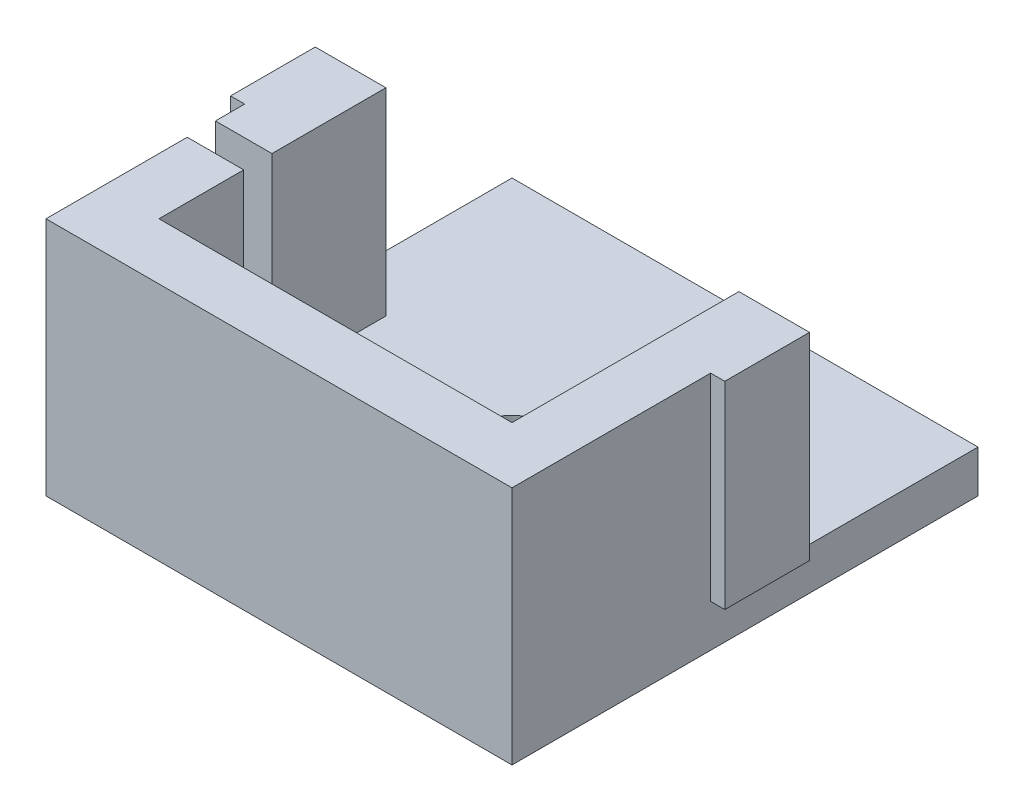
ISO-10303-21;
HEADER;
FILE_DESCRIPTION(('STEP AP214'),'2;1');
FILE_NAME('part.step','',(''),(''),'','','');
FILE_SCHEMA(('AUTOMOTIVE_DESIGN { 1 0 10303 214 1 1 1 1 }'));
ENDSEC;
DATA;
#1=APPLICATION_CONTEXT('core data for automotive mechanical design processes');
#2=APPLICATION_PROTOCOL_DEFINITION('international standard','automotive_design',2000,#1);
#3=PRODUCT_CONTEXT('',#1,'mechanical');
#4=PRODUCT('Part','Part','',(#3));
#5=PRODUCT_RELATED_PRODUCT_CATEGORY('part','',(#4));
#6=PRODUCT_DEFINITION_FORMATION('','',#4);
#7=PRODUCT_DEFINITION_CONTEXT('part definition',#1,'design');
#8=PRODUCT_DEFINITION('design','',#6,#7);
#9=PRODUCT_DEFINITION_SHAPE('','',#8);
#10=(LENGTH_UNIT() NAMED_UNIT(*) SI_UNIT(.MILLI.,.METRE.));
#11=(NAMED_UNIT(*) PLANE_ANGLE_UNIT() SI_UNIT($,.RADIAN.));
#12=(NAMED_UNIT(*) SI_UNIT($,.STERADIAN.) SOLID_ANGLE_UNIT());
#13=UNCERTAINTY_MEASURE_WITH_UNIT(LENGTH_MEASURE(1.E-05),#10,'distance_accuracy_value','');
#14=(GEOMETRIC_REPRESENTATION_CONTEXT(3) GLOBAL_UNCERTAINTY_ASSIGNED_CONTEXT((#13)) GLOBAL_UNIT_ASSIGNED_CONTEXT((#10,
#11,#12)) REPRESENTATION_CONTEXT('',''));
#15=CARTESIAN_POINT('',(0.,0.,0.));
#16=DIRECTION('',(0.,0.,1.));
#17=DIRECTION('',(1.,0.,0.));
#18=AXIS2_PLACEMENT_3D('',#15,#16,#17);
#19=CARTESIAN_POINT('',(-14.2941176470588,3.,-10.8529411764706));
#20=DIRECTION('',(-1.,0.,0.));
#21=DIRECTION('',(0.,0.,1.));
#22=AXIS2_PLACEMENT_3D('',#19,#20,#21);
#23=PLANE('',#22);
#24=DIRECTION('',(0.,0.,1.));
#25=VECTOR('',#24,1.);
#26=CARTESIAN_POINT('',(-14.2941176470588,17.,-10.8529411764706));
#27=LINE('',#26,#25);
#28=CARTESIAN_POINT('',(-14.2941176470588,17.,-1.9215861258733));
#29=VERTEX_POINT('',#28);
#30=CARTESIAN_POINT('',(-14.2941176470588,17.,6.14705882352941));
#31=VERTEX_POINT('',#30);
#32=EDGE_CURVE('E269',#29,#31,#27,.T.);
#33=ORIENTED_EDGE('',*,*,#32,.T.);
#34=DIRECTION('',(0.,1.,0.));
#35=VECTOR('',#34,1.);
#36=CARTESIAN_POINT('',(-14.2941176470588,3.,6.14705882352941));
#37=LINE('',#36,#35);
#38=CARTESIAN_POINT('',(-14.2941176470588,3.,6.14705882352941));
#39=VERTEX_POINT('',#38);
#40=EDGE_CURVE('E188',#39,#31,#37,.T.);
#41=ORIENTED_EDGE('',*,*,#40,.F.);
#42=DIRECTION('',(0.,0.,1.));
#43=VECTOR('',#42,1.);
#44=CARTESIAN_POINT('',(-14.2941176470588,3.,-10.8529411764706));
#45=LINE('',#44,#43);
#46=CARTESIAN_POINT('',(-14.2941176470588,3.,-1.9215861258733));
#47=VERTEX_POINT('',#46);
#48=EDGE_CURVE('E259',#47,#39,#45,.T.);
#49=ORIENTED_EDGE('',*,*,#48,.F.);
#50=DIRECTION('',(0.,1.,0.));
#51=VECTOR('',#50,1.);
#52=CARTESIAN_POINT('',(-14.2941176470588,3.,-1.9215861258733));
#53=LINE('',#52,#51);
#54=EDGE_CURVE('E248',#47,#29,#53,.T.);
#55=ORIENTED_EDGE('',*,*,#54,.T.);
#56=EDGE_LOOP('',(#33,#41,#49,#55));
#57=FACE_BOUND('',#56,.T.);
#58=ADVANCED_FACE('F34',(#57),#23,.F.);
#59=CARTESIAN_POINT('',(0.,17.,0.));
#60=DIRECTION('',(0.,1.,0.));
#61=DIRECTION('',(0.,0.,1.));
#62=AXIS2_PLACEMENT_3D('',#59,#60,#61);
#63=PLANE('',#62);
#64=DIRECTION('',(-1.,0.,0.));
#65=VECTOR('',#64,1.);
#66=CARTESIAN_POINT('',(-18.2941176470588,17.,6.14705882352941));
#67=LINE('',#66,#65);
#68=CARTESIAN_POINT('',(-18.2941176470588,17.,6.14705882352941));
#69=VERTEX_POINT('',#68);
#70=EDGE_CURVE('E182',#31,#69,#67,.T.);
#71=ORIENTED_EDGE('',*,*,#70,.F.);
#72=ORIENTED_EDGE('',*,*,#32,.F.);
#73=DIRECTION('',(1.,0.,0.));
#74=VECTOR('',#73,1.);
#75=CARTESIAN_POINT('',(-14.2941176470588,17.,-1.9215861258733));
#76=LINE('',#75,#74);
#77=CARTESIAN_POINT('',(-19.2941176470588,17.,-1.9215861258733));
#78=VERTEX_POINT('',#77);
#79=EDGE_CURVE('E239',#78,#29,#76,.T.);
#80=ORIENTED_EDGE('',*,*,#79,.F.);
#81=DIRECTION('',(0.,0.,1.));
#82=VECTOR('',#81,1.);
#83=CARTESIAN_POINT('',(-19.2941176470588,17.,4.0784138741267));
#84=LINE('',#83,#82);
#85=CARTESIAN_POINT('',(-19.2941176470588,17.,4.0784138741267));
#86=VERTEX_POINT('',#85);
#87=EDGE_CURVE('E193',#78,#86,#84,.T.);
#88=ORIENTED_EDGE('',*,*,#87,.T.);
#89=DIRECTION('',(1.,0.,0.));
#90=VECTOR('',#89,1.);
#91=CARTESIAN_POINT('',(-18.2941176470588,17.,4.0784138741267));
#92=LINE('',#91,#90);
#93=CARTESIAN_POINT('',(-18.2941176470588,17.,4.0784138741267));
#94=VERTEX_POINT('',#93);
#95=EDGE_CURVE('E195',#86,#94,#92,.T.);
#96=ORIENTED_EDGE('',*,*,#95,.T.);
#97=DIRECTION('',(0.,0.,1.));
#98=VECTOR('',#97,1.);
#99=CARTESIAN_POINT('',(-18.2941176470588,17.,-14.8529411764706));
#100=LINE('',#99,#98);
#101=EDGE_CURVE('E286',#94,#69,#100,.T.);
#102=ORIENTED_EDGE('',*,*,#101,.T.);
#103=EDGE_LOOP('',(#71,#72,#80,#88,#96,#102));
#104=FACE_BOUND('',#103,.T.);
#105=ADVANCED_FACE('F385',(#104),#63,.T.);
#106=CARTESIAN_POINT('',(-18.2941176470588,17.,-14.8529411764706));
#107=DIRECTION('',(0.,0.,1.));
#108=DIRECTION('',(1.,0.,0.));
#109=AXIS2_PLACEMENT_3D('',#106,#107,#108);
#110=PLANE('',#109);
#111=DIRECTION('',(0.,-1.,0.));
#112=VECTOR('',#111,1.);
#113=CARTESIAN_POINT('',(-18.2941176470588,17.,-14.8529411764706));
#114=LINE('',#113,#112);
#115=CARTESIAN_POINT('',(-18.2941176470588,3.,-14.8529411764706));
#116=VERTEX_POINT('',#115);
#117=CARTESIAN_POINT('',(-18.2941176470588,0.,-14.8529411764706));
#118=VERTEX_POINT('',#117);
#119=EDGE_CURVE('E294',#116,#118,#114,.T.);
#120=ORIENTED_EDGE('',*,*,#119,.F.);
#121=DIRECTION('',(-1.,0.,0.));
#122=VECTOR('',#121,1.);
#123=CARTESIAN_POINT('',(10.7058823529412,3.,-14.8529411764706));
#124=LINE('',#123,#122);
#125=CARTESIAN_POINT('',(14.7058823529412,3.,-14.8529411764706));
#126=VERTEX_POINT('',#125);
#127=EDGE_CURVE('E237',#126,#116,#124,.T.);
#128=ORIENTED_EDGE('',*,*,#127,.F.);
#129=DIRECTION('',(0.,-1.,0.));
#130=VECTOR('',#129,1.);
#131=CARTESIAN_POINT('',(14.7058823529412,17.,-14.8529411764706));
#132=LINE('',#131,#130);
#133=CARTESIAN_POINT('',(14.7058823529412,0.,-14.8529411764706));
#134=VERTEX_POINT('',#133);
#135=EDGE_CURVE('E306',#126,#134,#132,.T.);
#136=ORIENTED_EDGE('',*,*,#135,.T.);
#137=DIRECTION('',(-1.,0.,0.));
#138=VECTOR('',#137,1.);
#139=CARTESIAN_POINT('',(-18.2941176470588,0.,-14.8529411764706));
#140=LINE('',#139,#138);
#141=EDGE_CURVE('E302',#134,#118,#140,.T.);
#142=ORIENTED_EDGE('',*,*,#141,.T.);
#143=EDGE_LOOP('',(#120,#128,#136,#142));
#144=FACE_BOUND('',#143,.T.);
#145=ADVANCED_FACE('F325',(#144),#110,.F.);
#146=CARTESIAN_POINT('',(-18.2941176470588,17.,-14.8529411764706));
#147=DIRECTION('',(1.,0.,0.));
#148=DIRECTION('',(0.,0.,-1.));
#149=AXIS2_PLACEMENT_3D('',#146,#147,#148);
#150=PLANE('',#149);
#151=DIRECTION('',(0.,0.,1.));
#152=VECTOR('',#151,1.);
#153=CARTESIAN_POINT('',(-18.2941176470588,3.,6.14705882352941));
#154=LINE('',#153,#152);
#155=CARTESIAN_POINT('',(-18.2941176470588,3.,6.14705882352941));
#156=VERTEX_POINT('',#155);
#157=CARTESIAN_POINT('',(-18.2941176470588,3.,8.14705882352941));
#158=VERTEX_POINT('',#157);
#159=EDGE_CURVE('E173',#156,#158,#154,.T.);
#160=ORIENTED_EDGE('',*,*,#159,.F.);
#161=DIRECTION('',(0.,1.,0.));
#162=VECTOR('',#161,1.);
#163=CARTESIAN_POINT('',(-18.2941176470588,3.,6.14705882352941));
#164=LINE('',#163,#162);
#165=EDGE_CURVE('E201',#156,#69,#164,.T.);
#166=ORIENTED_EDGE('',*,*,#165,.T.);
#167=ORIENTED_EDGE('',*,*,#101,.F.);
#168=DIRECTION('',(0.,-1.,0.));
#169=VECTOR('',#168,1.);
#170=CARTESIAN_POINT('',(-18.2941176470588,17.,4.0784138741267));
#171=LINE('',#170,#169);
#172=CARTESIAN_POINT('',(-18.2941176470588,3.,4.0784138741267));
#173=VERTEX_POINT('',#172);
#174=EDGE_CURVE('E198',#94,#173,#171,.T.);
#175=ORIENTED_EDGE('',*,*,#174,.T.);
#176=DIRECTION('',(0.,0.,-1.));
#177=VECTOR('',#176,1.);
#178=CARTESIAN_POINT('',(-18.2941176470588,3.,4.0784138741267));
#179=LINE('',#178,#177);
#180=CARTESIAN_POINT('',(-18.2941176470588,3.,-1.9215861258733));
#181=VERTEX_POINT('',#180);
#182=EDGE_CURVE('E58',#173,#181,#179,.T.);
#183=ORIENTED_EDGE('',*,*,#182,.T.);
#184=DIRECTION('',(0.,0.,1.));
#185=VECTOR('',#184,1.);
#186=CARTESIAN_POINT('',(-18.2941176470588,3.,-4.9215861258733));
#187=LINE('',#186,#185);
#188=EDGE_CURVE('E251',#116,#181,#187,.T.);
#189=ORIENTED_EDGE('',*,*,#188,.F.);
#190=ORIENTED_EDGE('',*,*,#119,.T.);
#191=DIRECTION('',(0.,0.,1.));
#192=VECTOR('',#191,1.);
#193=CARTESIAN_POINT('',(-18.2941176470588,0.,-14.8529411764706));
#194=LINE('',#193,#192);
#195=CARTESIAN_POINT('',(-18.2941176470588,0.,18.1470588235294));
#196=VERTEX_POINT('',#195);
#197=EDGE_CURVE('E285',#118,#196,#194,.T.);
#198=ORIENTED_EDGE('',*,*,#197,.T.);
#199=DIRECTION('',(0.,-1.,0.));
#200=VECTOR('',#199,1.);
#201=CARTESIAN_POINT('',(-18.2941176470588,17.,18.1470588235294));
#202=LINE('',#201,#200);
#203=CARTESIAN_POINT('',(-18.2941176470588,17.,18.1470588235294));
#204=VERTEX_POINT('',#203);
#205=EDGE_CURVE('E11',#204,#196,#202,.T.);
#206=ORIENTED_EDGE('',*,*,#205,.F.);
#207=CARTESIAN_POINT('',(-18.2941176470588,17.,8.14705882352941));
#208=VERTEX_POINT('',#207);
#209=EDGE_CURVE('E186',#208,#204,#100,.T.);
#210=ORIENTED_EDGE('',*,*,#209,.F.);
#211=DIRECTION('',(0.,1.,0.));
#212=VECTOR('',#211,1.);
#213=CARTESIAN_POINT('',(-18.2941176470588,3.,8.14705882352941));
#214=LINE('',#213,#212);
#215=EDGE_CURVE('E167',#158,#208,#214,.T.);
#216=ORIENTED_EDGE('',*,*,#215,.F.);
#217=EDGE_LOOP('',(#160,#166,#167,#175,#183,#189,#190,#198,#206,#210,#216));
#218=FACE_BOUND('',#217,.T.);
#219=ADVANCED_FACE('F36',(#218),#150,.F.);
#220=CARTESIAN_POINT('',(14.7058823529412,17.,-14.8529411764706));
#221=DIRECTION('',(-1.,0.,0.));
#222=DIRECTION('',(0.,0.,1.));
#223=AXIS2_PLACEMENT_3D('',#220,#221,#222);
#224=PLANE('',#223);
#225=DIRECTION('',(0.,0.,-1.));
#226=VECTOR('',#225,1.);
#227=CARTESIAN_POINT('',(14.7058823529412,3.,-4.9215861258733));
#228=LINE('',#227,#226);
#229=CARTESIAN_POINT('',(14.7058823529412,3.,-1.9215861258733));
#230=VERTEX_POINT('',#229);
#231=EDGE_CURVE('E242',#230,#126,#228,.T.);
#232=ORIENTED_EDGE('',*,*,#231,.F.);
#233=DIRECTION('',(0.,0.,1.));
#234=VECTOR('',#233,1.);
#235=CARTESIAN_POINT('',(14.7058823529412,3.,4.0784138741267));
#236=LINE('',#235,#234);
#237=CARTESIAN_POINT('',(14.7058823529412,3.,4.0784138741267));
#238=VERTEX_POINT('',#237);
#239=EDGE_CURVE('E214',#230,#238,#236,.T.);
#240=ORIENTED_EDGE('',*,*,#239,.T.);
#241=DIRECTION('',(0.,-1.,0.));
#242=VECTOR('',#241,1.);
#243=CARTESIAN_POINT('',(14.7058823529412,17.,4.0784138741267));
#244=LINE('',#243,#242);
#245=CARTESIAN_POINT('',(14.7058823529412,17.,4.0784138741267));
#246=VERTEX_POINT('',#245);
#247=EDGE_CURVE('E234',#246,#238,#244,.T.);
#248=ORIENTED_EDGE('',*,*,#247,.F.);
#249=DIRECTION('',(0.,0.,-1.));
#250=VECTOR('',#249,1.);
#251=CARTESIAN_POINT('',(14.7058823529412,17.,-14.8529411764706));
#252=LINE('',#251,#250);
#253=CARTESIAN_POINT('',(14.7058823529412,17.,18.1470588235294));
#254=VERTEX_POINT('',#253);
#255=EDGE_CURVE('E291',#254,#246,#252,.T.);
#256=ORIENTED_EDGE('',*,*,#255,.F.);
#257=DIRECTION('',(0.,-1.,0.));
#258=VECTOR('',#257,1.);
#259=CARTESIAN_POINT('',(14.7058823529412,17.,18.1470588235294));
#260=LINE('',#259,#258);
#261=CARTESIAN_POINT('',(14.7058823529412,0.,18.1470588235294));
#262=VERTEX_POINT('',#261);
#263=EDGE_CURVE('E43',#254,#262,#260,.T.);
#264=ORIENTED_EDGE('',*,*,#263,.T.);
#265=DIRECTION('',(0.,0.,-1.));
#266=VECTOR('',#265,1.);
#267=CARTESIAN_POINT('',(14.7058823529412,0.,-14.8529411764706));
#268=LINE('',#267,#266);
#269=EDGE_CURVE('E299',#262,#134,#268,.T.);
#270=ORIENTED_EDGE('',*,*,#269,.T.);
#271=ORIENTED_EDGE('',*,*,#135,.F.);
#272=EDGE_LOOP('',(#232,#240,#248,#256,#264,#270,#271));
#273=FACE_BOUND('',#272,.T.);
#274=ADVANCED_FACE('F314',(#273),#224,.F.);
#275=CARTESIAN_POINT('',(-14.2941176470588,3.,8.14705882352941));
#276=VERTEX_POINT('',#275);
#277=CARTESIAN_POINT('',(-14.2941176470588,3.,14.1470588235294));
#278=VERTEX_POINT('',#277);
#279=EDGE_CURVE('E262',#276,#278,#45,.T.);
#280=ORIENTED_EDGE('',*,*,#279,.F.);
#281=DIRECTION('',(0.,1.,0.));
#282=VECTOR('',#281,1.);
#283=CARTESIAN_POINT('',(-14.2941176470588,3.,8.14705882352941));
#284=LINE('',#283,#282);
#285=CARTESIAN_POINT('',(-14.2941176470588,17.,8.14705882352941));
#286=VERTEX_POINT('',#285);
#287=EDGE_CURVE('E170',#276,#286,#284,.T.);
#288=ORIENTED_EDGE('',*,*,#287,.T.);
#289=CARTESIAN_POINT('',(-14.2941176470588,17.,14.1470588235294));
#290=VERTEX_POINT('',#289);
#291=EDGE_CURVE('E250',#286,#290,#27,.T.);
#292=ORIENTED_EDGE('',*,*,#291,.T.);
#293=DIRECTION('',(0.,1.,0.));
#294=VECTOR('',#293,1.);
#295=CARTESIAN_POINT('',(-14.2941176470588,3.,14.1470588235294));
#296=LINE('',#295,#294);
#297=EDGE_CURVE('E268',#278,#290,#296,.T.);
#298=ORIENTED_EDGE('',*,*,#297,.F.);
#299=EDGE_LOOP('',(#280,#288,#292,#298));
#300=FACE_BOUND('',#299,.T.);
#301=ADVANCED_FACE('F361',(#300),#23,.F.);
#302=CARTESIAN_POINT('',(-1.79411764705882,17.,1.64705882352941));
#303=DIRECTION('',(0.,-1.,0.));
#304=DIRECTION('',(0.,0.,-1.));
#305=AXIS2_PLACEMENT_3D('',#302,#303,#304);
#306=CYLINDRICAL_SURFACE('',#305,2.75);
#307=CARTESIAN_POINT('',(-1.79411764705882,0.,1.64705882352941));
#308=DIRECTION('',(0.,1.,0.));
#309=DIRECTION('',(0.,0.,1.));
#310=AXIS2_PLACEMENT_3D('',#307,#308,#309);
#311=CIRCLE('',#310,2.75);
#312=CARTESIAN_POINT('',(-1.79411764705882,0.,4.39705882352941));
#313=VERTEX_POINT('',#312);
#314=EDGE_CURVE('E282',#313,#313,#311,.T.);
#315=ORIENTED_EDGE('',*,*,#314,.F.);
#316=EDGE_LOOP('',(#315));
#317=FACE_BOUND('',#316,.T.);
#318=CARTESIAN_POINT('',(-1.79411764705882,3.,1.64705882352941));
#319=DIRECTION('',(0.,1.,0.));
#320=DIRECTION('',(0.,0.,1.));
#321=AXIS2_PLACEMENT_3D('',#318,#319,#320);
#322=CIRCLE('',#321,2.75);
#323=CARTESIAN_POINT('',(-1.79411764705882,3.,4.39705882352941));
#324=VERTEX_POINT('',#323);
#325=EDGE_CURVE('E38',#324,#324,#322,.T.);
#326=ORIENTED_EDGE('',*,*,#325,.T.);
#327=EDGE_LOOP('',(#326));
#328=FACE_BOUND('',#327,.T.);
#329=ADVANCED_FACE('F395',(#317,#328),#306,.F.);
#330=DIRECTION('',(1.,0.,0.));
#331=VECTOR('',#330,1.);
#332=CARTESIAN_POINT('',(-18.2941176470588,17.,8.14705882352941));
#333=LINE('',#332,#331);
#334=EDGE_CURVE('E358',#208,#286,#333,.T.);
#335=ORIENTED_EDGE('',*,*,#334,.F.);
#336=ORIENTED_EDGE('',*,*,#209,.T.);
#337=DIRECTION('',(1.,0.,0.));
#338=VECTOR('',#337,1.);
#339=CARTESIAN_POINT('',(-18.2941176470588,17.,18.1470588235294));
#340=LINE('',#339,#338);
#341=EDGE_CURVE('E289',#204,#254,#340,.T.);
#342=ORIENTED_EDGE('',*,*,#341,.T.);
#343=ORIENTED_EDGE('',*,*,#255,.T.);
#344=DIRECTION('',(1.,0.,0.));
#345=VECTOR('',#344,1.);
#346=CARTESIAN_POINT('',(14.7058823529412,17.,4.0784138741267));
#347=LINE('',#346,#345);
#348=CARTESIAN_POINT('',(15.7058823529412,17.,4.0784138741267));
#349=VERTEX_POINT('',#348);
#350=EDGE_CURVE('E215',#246,#349,#347,.T.);
#351=ORIENTED_EDGE('',*,*,#350,.T.);
#352=DIRECTION('',(0.,0.,-1.));
#353=VECTOR('',#352,1.);
#354=CARTESIAN_POINT('',(15.7058823529412,17.,4.0784138741267));
#355=LINE('',#354,#353);
#356=CARTESIAN_POINT('',(15.7058823529412,17.,-1.9215861258733));
#357=VERTEX_POINT('',#356);
#358=EDGE_CURVE('E217',#349,#357,#355,.T.);
#359=ORIENTED_EDGE('',*,*,#358,.T.);
#360=DIRECTION('',(1.,0.,0.));
#361=VECTOR('',#360,1.);
#362=CARTESIAN_POINT('',(10.7058823529412,17.,-1.9215861258733));
#363=LINE('',#362,#361);
#364=CARTESIAN_POINT('',(10.7058823529412,17.,-1.9215861258733));
#365=VERTEX_POINT('',#364);
#366=EDGE_CURVE('E243',#365,#357,#363,.T.);
#367=ORIENTED_EDGE('',*,*,#366,.F.);
#368=DIRECTION('',(0.,0.,-1.));
#369=VECTOR('',#368,1.);
#370=CARTESIAN_POINT('',(10.7058823529412,17.,-10.8529411764706));
#371=LINE('',#370,#369);
#372=CARTESIAN_POINT('',(10.7058823529412,17.,14.1470588235294));
#373=VERTEX_POINT('',#372);
#374=EDGE_CURVE('E275',#373,#365,#371,.T.);
#375=ORIENTED_EDGE('',*,*,#374,.F.);
#376=DIRECTION('',(1.,0.,0.));
#377=VECTOR('',#376,1.);
#378=CARTESIAN_POINT('',(-14.2941176470588,17.,14.1470588235294));
#379=LINE('',#378,#377);
#380=EDGE_CURVE('E272',#290,#373,#379,.T.);
#381=ORIENTED_EDGE('',*,*,#380,.F.);
#382=ORIENTED_EDGE('',*,*,#291,.F.);
#383=EDGE_LOOP('',(#335,#336,#342,#343,#351,#359,#367,#375,#381,#382));
#384=FACE_BOUND('',#383,.T.);
#385=ADVANCED_FACE('F341',(#384),#63,.T.);
#386=CARTESIAN_POINT('',(0.,0.,0.));
#387=DIRECTION('',(0.,1.,0.));
#388=DIRECTION('',(0.,0.,1.));
#389=AXIS2_PLACEMENT_3D('',#386,#387,#388);
#390=PLANE('',#389);
#391=ORIENTED_EDGE('',*,*,#197,.F.);
#392=ORIENTED_EDGE('',*,*,#141,.F.);
#393=ORIENTED_EDGE('',*,*,#269,.F.);
#394=DIRECTION('',(1.,0.,0.));
#395=VECTOR('',#394,1.);
#396=CARTESIAN_POINT('',(-18.2941176470588,0.,18.1470588235294));
#397=LINE('',#396,#395);
#398=EDGE_CURVE('E297',#196,#262,#397,.T.);
#399=ORIENTED_EDGE('',*,*,#398,.F.);
#400=EDGE_LOOP('',(#391,#392,#393,#399));
#401=FACE_BOUND('',#400,.T.);
#402=ORIENTED_EDGE('',*,*,#314,.T.);
#403=EDGE_LOOP('',(#402));
#404=FACE_BOUND('',#403,.T.);
#405=ADVANCED_FACE('F321',(#401,#404),#390,.F.);
#406=CARTESIAN_POINT('',(-18.2941176470588,17.,18.1470588235294));
#407=DIRECTION('',(0.,0.,-1.));
#408=DIRECTION('',(-1.,0.,0.));
#409=AXIS2_PLACEMENT_3D('',#406,#407,#408);
#410=PLANE('',#409);
#411=ORIENTED_EDGE('',*,*,#398,.T.);
#412=ORIENTED_EDGE('',*,*,#263,.F.);
#413=ORIENTED_EDGE('',*,*,#341,.F.);
#414=ORIENTED_EDGE('',*,*,#205,.T.);
#415=EDGE_LOOP('',(#411,#412,#413,#414));
#416=FACE_BOUND('',#415,.T.);
#417=ADVANCED_FACE('F342',(#416),#410,.F.);
#418=CARTESIAN_POINT('',(10.7058823529412,3.,-10.8529411764706));
#419=DIRECTION('',(1.,0.,0.));
#420=DIRECTION('',(0.,0.,-1.));
#421=AXIS2_PLACEMENT_3D('',#418,#419,#420);
#422=PLANE('',#421);
#423=ORIENTED_EDGE('',*,*,#374,.T.);
#424=DIRECTION('',(0.,1.,0.));
#425=VECTOR('',#424,1.);
#426=CARTESIAN_POINT('',(10.7058823529412,3.,-1.9215861258733));
#427=LINE('',#426,#425);
#428=CARTESIAN_POINT('',(10.7058823529412,3.,-1.9215861258733));
#429=VERTEX_POINT('',#428);
#430=EDGE_CURVE('E246',#429,#365,#427,.T.);
#431=ORIENTED_EDGE('',*,*,#430,.F.);
#432=DIRECTION('',(0.,0.,-1.));
#433=VECTOR('',#432,1.);
#434=CARTESIAN_POINT('',(10.7058823529412,3.,-10.8529411764706));
#435=LINE('',#434,#433);
#436=CARTESIAN_POINT('',(10.7058823529412,3.,14.1470588235294));
#437=VERTEX_POINT('',#436);
#438=EDGE_CURVE('E265',#437,#429,#435,.T.);
#439=ORIENTED_EDGE('',*,*,#438,.F.);
#440=DIRECTION('',(0.,1.,0.));
#441=VECTOR('',#440,1.);
#442=CARTESIAN_POINT('',(10.7058823529412,3.,14.1470588235294));
#443=LINE('',#442,#441);
#444=EDGE_CURVE('E278',#437,#373,#443,.T.);
#445=ORIENTED_EDGE('',*,*,#444,.T.);
#446=EDGE_LOOP('',(#423,#431,#439,#445));
#447=FACE_BOUND('',#446,.T.);
#448=ADVANCED_FACE('F371',(#447),#422,.F.);
#449=CARTESIAN_POINT('',(-14.2941176470588,3.,14.1470588235294));
#450=DIRECTION('',(0.,0.,1.));
#451=DIRECTION('',(1.,0.,0.));
#452=AXIS2_PLACEMENT_3D('',#449,#450,#451);
#453=PLANE('',#452);
#454=ORIENTED_EDGE('',*,*,#380,.T.);
#455=ORIENTED_EDGE('',*,*,#444,.F.);
#456=DIRECTION('',(1.,0.,0.));
#457=VECTOR('',#456,1.);
#458=CARTESIAN_POINT('',(-14.2941176470588,3.,14.1470588235294));
#459=LINE('',#458,#457);
#460=EDGE_CURVE('E261',#278,#437,#459,.T.);
#461=ORIENTED_EDGE('',*,*,#460,.F.);
#462=ORIENTED_EDGE('',*,*,#297,.T.);
#463=EDGE_LOOP('',(#454,#455,#461,#462));
#464=FACE_BOUND('',#463,.T.);
#465=ADVANCED_FACE('F367',(#464),#453,.F.);
#466=CARTESIAN_POINT('',(0.,3.,0.));
#467=DIRECTION('',(0.,1.,0.));
#468=DIRECTION('',(0.,0.,1.));
#469=AXIS2_PLACEMENT_3D('',#466,#467,#468);
#470=PLANE('',#469);
#471=ORIENTED_EDGE('',*,*,#127,.T.);
#472=ORIENTED_EDGE('',*,*,#188,.T.);
#473=DIRECTION('',(1.,0.,0.));
#474=VECTOR('',#473,1.);
#475=CARTESIAN_POINT('',(-14.2941176470588,3.,-1.9215861258733));
#476=LINE('',#475,#474);
#477=EDGE_CURVE('E254',#181,#47,#476,.T.);
#478=ORIENTED_EDGE('',*,*,#477,.T.);
#479=ORIENTED_EDGE('',*,*,#48,.T.);
#480=DIRECTION('',(-1.,0.,0.));
#481=VECTOR('',#480,1.);
#482=CARTESIAN_POINT('',(-18.2941176470588,3.,6.14705882352941));
#483=LINE('',#482,#481);
#484=EDGE_CURVE('E172',#39,#156,#483,.T.);
#485=ORIENTED_EDGE('',*,*,#484,.T.);
#486=ORIENTED_EDGE('',*,*,#159,.T.);
#487=DIRECTION('',(1.,0.,0.));
#488=VECTOR('',#487,1.);
#489=CARTESIAN_POINT('',(-18.2941176470588,3.,8.14705882352941));
#490=LINE('',#489,#488);
#491=EDGE_CURVE('E50',#158,#276,#490,.T.);
#492=ORIENTED_EDGE('',*,*,#491,.T.);
#493=ORIENTED_EDGE('',*,*,#279,.T.);
#494=ORIENTED_EDGE('',*,*,#460,.T.);
#495=ORIENTED_EDGE('',*,*,#438,.T.);
#496=DIRECTION('',(1.,0.,0.));
#497=VECTOR('',#496,1.);
#498=CARTESIAN_POINT('',(10.7058823529412,3.,-1.9215861258733));
#499=LINE('',#498,#497);
#500=EDGE_CURVE('E240',#429,#230,#499,.T.);
#501=ORIENTED_EDGE('',*,*,#500,.T.);
#502=ORIENTED_EDGE('',*,*,#231,.T.);
#503=EDGE_LOOP('',(#471,#472,#478,#479,#485,#486,#492,#493,#494,#495,#501,#502));
#504=FACE_BOUND('',#503,.T.);
#505=ORIENTED_EDGE('',*,*,#325,.F.);
#506=EDGE_LOOP('',(#505));
#507=FACE_BOUND('',#506,.T.);
#508=ADVANCED_FACE('F177',(#504,#507),#470,.T.);
#509=CARTESIAN_POINT('',(-14.2941176470588,3.,-1.9215861258733));
#510=DIRECTION('',(0.,0.,1.));
#511=DIRECTION('',(1.,0.,0.));
#512=AXIS2_PLACEMENT_3D('',#509,#510,#511);
#513=PLANE('',#512);
#514=ORIENTED_EDGE('',*,*,#79,.T.);
#515=ORIENTED_EDGE('',*,*,#54,.F.);
#516=ORIENTED_EDGE('',*,*,#477,.F.);
#517=DIRECTION('',(-1.,0.,0.));
#518=VECTOR('',#517,1.);
#519=CARTESIAN_POINT('',(-18.2941176470588,3.,-1.9215861258733));
#520=LINE('',#519,#518);
#521=CARTESIAN_POINT('',(-19.2941176470588,3.,-1.9215861258733));
#522=VERTEX_POINT('',#521);
#523=EDGE_CURVE('E200',#181,#522,#520,.T.);
#524=ORIENTED_EDGE('',*,*,#523,.T.);
#525=DIRECTION('',(0.,-1.,0.));
#526=VECTOR('',#525,1.);
#527=CARTESIAN_POINT('',(-19.2941176470588,17.,-1.9215861258733));
#528=LINE('',#527,#526);
#529=EDGE_CURVE('E211',#78,#522,#528,.T.);
#530=ORIENTED_EDGE('',*,*,#529,.F.);
#531=EDGE_LOOP('',(#514,#515,#516,#524,#530));
#532=FACE_BOUND('',#531,.T.);
#533=ADVANCED_FACE('F347',(#532),#513,.F.);
#534=CARTESIAN_POINT('',(10.7058823529412,3.,-1.9215861258733));
#535=DIRECTION('',(0.,0.,1.));
#536=DIRECTION('',(1.,0.,0.));
#537=AXIS2_PLACEMENT_3D('',#534,#535,#536);
#538=PLANE('',#537);
#539=ORIENTED_EDGE('',*,*,#366,.T.);
#540=DIRECTION('',(0.,-1.,0.));
#541=VECTOR('',#540,1.);
#542=CARTESIAN_POINT('',(15.7058823529412,17.,-1.9215861258733));
#543=LINE('',#542,#541);
#544=CARTESIAN_POINT('',(15.7058823529412,3.,-1.9215861258733));
#545=VERTEX_POINT('',#544);
#546=EDGE_CURVE('E221',#357,#545,#543,.T.);
#547=ORIENTED_EDGE('',*,*,#546,.T.);
#548=DIRECTION('',(-1.,0.,0.));
#549=VECTOR('',#548,1.);
#550=CARTESIAN_POINT('',(14.7058823529412,3.,-1.9215861258733));
#551=LINE('',#550,#549);
#552=EDGE_CURVE('E218',#545,#230,#551,.T.);
#553=ORIENTED_EDGE('',*,*,#552,.T.);
#554=ORIENTED_EDGE('',*,*,#500,.F.);
#555=ORIENTED_EDGE('',*,*,#430,.T.);
#556=EDGE_LOOP('',(#539,#547,#553,#554,#555));
#557=FACE_BOUND('',#556,.T.);
#558=ADVANCED_FACE('F330',(#557),#538,.F.);
#559=CARTESIAN_POINT('',(14.7058823529412,17.,4.0784138741267));
#560=DIRECTION('',(0.,0.,-1.));
#561=DIRECTION('',(-1.,0.,0.));
#562=AXIS2_PLACEMENT_3D('',#559,#560,#561);
#563=PLANE('',#562);
#564=DIRECTION('',(1.,0.,0.));
#565=VECTOR('',#564,1.);
#566=CARTESIAN_POINT('',(14.7058823529412,3.,4.0784138741267));
#567=LINE('',#566,#565);
#568=CARTESIAN_POINT('',(15.7058823529412,3.,4.0784138741267));
#569=VERTEX_POINT('',#568);
#570=EDGE_CURVE('E223',#238,#569,#567,.T.);
#571=ORIENTED_EDGE('',*,*,#570,.T.);
#572=DIRECTION('',(0.,-1.,0.));
#573=VECTOR('',#572,1.);
#574=CARTESIAN_POINT('',(15.7058823529412,17.,4.0784138741267));
#575=LINE('',#574,#573);
#576=EDGE_CURVE('E231',#349,#569,#575,.T.);
#577=ORIENTED_EDGE('',*,*,#576,.F.);
#578=ORIENTED_EDGE('',*,*,#350,.F.);
#579=ORIENTED_EDGE('',*,*,#247,.T.);
#580=EDGE_LOOP('',(#571,#577,#578,#579));
#581=FACE_BOUND('',#580,.T.);
#582=ADVANCED_FACE('F339',(#581),#563,.F.);
#583=CARTESIAN_POINT('',(15.7058823529412,17.,4.0784138741267));
#584=DIRECTION('',(-1.,0.,0.));
#585=DIRECTION('',(0.,0.,1.));
#586=AXIS2_PLACEMENT_3D('',#583,#584,#585);
#587=PLANE('',#586);
#588=DIRECTION('',(0.,0.,-1.));
#589=VECTOR('',#588,1.);
#590=CARTESIAN_POINT('',(15.7058823529412,3.,4.0784138741267));
#591=LINE('',#590,#589);
#592=EDGE_CURVE('E225',#569,#545,#591,.T.);
#593=ORIENTED_EDGE('',*,*,#592,.T.);
#594=ORIENTED_EDGE('',*,*,#546,.F.);
#595=ORIENTED_EDGE('',*,*,#358,.F.);
#596=ORIENTED_EDGE('',*,*,#576,.T.);
#597=EDGE_LOOP('',(#593,#594,#595,#596));
#598=FACE_BOUND('',#597,.T.);
#599=ADVANCED_FACE('F374',(#598),#587,.F.);
#600=CARTESIAN_POINT('',(0.,3.,0.));
#601=DIRECTION('',(0.,-1.,0.));
#602=DIRECTION('',(0.,0.,-1.));
#603=AXIS2_PLACEMENT_3D('',#600,#601,#602);
#604=PLANE('',#603);
#605=ORIENTED_EDGE('',*,*,#239,.F.);
#606=ORIENTED_EDGE('',*,*,#552,.F.);
#607=ORIENTED_EDGE('',*,*,#592,.F.);
#608=ORIENTED_EDGE('',*,*,#570,.F.);
#609=EDGE_LOOP('',(#605,#606,#607,#608));
#610=FACE_BOUND('',#609,.T.);
#611=ADVANCED_FACE('F335',(#610),#604,.T.);
#612=CARTESIAN_POINT('',(-19.2941176470588,17.,4.0784138741267));
#613=DIRECTION('',(1.,0.,0.));
#614=DIRECTION('',(0.,0.,-1.));
#615=AXIS2_PLACEMENT_3D('',#612,#613,#614);
#616=PLANE('',#615);
#617=DIRECTION('',(0.,0.,1.));
#618=VECTOR('',#617,1.);
#619=CARTESIAN_POINT('',(-19.2941176470588,3.,4.0784138741267));
#620=LINE('',#619,#618);
#621=CARTESIAN_POINT('',(-19.2941176470588,3.,4.0784138741267));
#622=VERTEX_POINT('',#621);
#623=EDGE_CURVE('E203',#522,#622,#620,.T.);
#624=ORIENTED_EDGE('',*,*,#623,.T.);
#625=DIRECTION('',(0.,-1.,0.));
#626=VECTOR('',#625,1.);
#627=CARTESIAN_POINT('',(-19.2941176470588,17.,4.0784138741267));
#628=LINE('',#627,#626);
#629=EDGE_CURVE('E208',#86,#622,#628,.T.);
#630=ORIENTED_EDGE('',*,*,#629,.F.);
#631=ORIENTED_EDGE('',*,*,#87,.F.);
#632=ORIENTED_EDGE('',*,*,#529,.T.);
#633=EDGE_LOOP('',(#624,#630,#631,#632));
#634=FACE_BOUND('',#633,.T.);
#635=ADVANCED_FACE('F381',(#634),#616,.F.);
#636=CARTESIAN_POINT('',(-18.2941176470588,17.,4.0784138741267));
#637=DIRECTION('',(0.,0.,-1.));
#638=DIRECTION('',(-1.,0.,0.));
#639=AXIS2_PLACEMENT_3D('',#636,#637,#638);
#640=PLANE('',#639);
#641=DIRECTION('',(1.,0.,0.));
#642=VECTOR('',#641,1.);
#643=CARTESIAN_POINT('',(-18.2941176470588,3.,4.0784138741267));
#644=LINE('',#643,#642);
#645=EDGE_CURVE('E196',#622,#173,#644,.T.);
#646=ORIENTED_EDGE('',*,*,#645,.T.);
#647=ORIENTED_EDGE('',*,*,#174,.F.);
#648=ORIENTED_EDGE('',*,*,#95,.F.);
#649=ORIENTED_EDGE('',*,*,#629,.T.);
#650=EDGE_LOOP('',(#646,#647,#648,#649));
#651=FACE_BOUND('',#650,.T.);
#652=ADVANCED_FACE('F498',(#651),#640,.F.);
#653=CARTESIAN_POINT('',(0.,3.,0.));
#654=DIRECTION('',(0.,1.,0.));
#655=DIRECTION('',(0.,0.,1.));
#656=AXIS2_PLACEMENT_3D('',#653,#654,#655);
#657=PLANE('',#656);
#658=ORIENTED_EDGE('',*,*,#182,.F.);
#659=ORIENTED_EDGE('',*,*,#645,.F.);
#660=ORIENTED_EDGE('',*,*,#623,.F.);
#661=ORIENTED_EDGE('',*,*,#523,.F.);
#662=EDGE_LOOP('',(#658,#659,#660,#661));
#663=FACE_BOUND('',#662,.T.);
#664=ADVANCED_FACE('F508',(#663),#657,.F.);
#665=CARTESIAN_POINT('',(-18.2941176470588,3.,6.14705882352941));
#666=DIRECTION('',(0.,0.,-1.));
#667=DIRECTION('',(-1.,0.,0.));
#668=AXIS2_PLACEMENT_3D('',#665,#666,#667);
#669=PLANE('',#668);
#670=ORIENTED_EDGE('',*,*,#70,.T.);
#671=ORIENTED_EDGE('',*,*,#165,.F.);
#672=ORIENTED_EDGE('',*,*,#484,.F.);
#673=ORIENTED_EDGE('',*,*,#40,.T.);
#674=EDGE_LOOP('',(#670,#671,#672,#673));
#675=FACE_BOUND('',#674,.T.);
#676=ADVANCED_FACE('F517',(#675),#669,.F.);
#677=CARTESIAN_POINT('',(-18.2941176470588,3.,8.14705882352941));
#678=DIRECTION('',(0.,0.,1.));
#679=DIRECTION('',(1.,0.,0.));
#680=AXIS2_PLACEMENT_3D('',#677,#678,#679);
#681=PLANE('',#680);
#682=ORIENTED_EDGE('',*,*,#334,.T.);
#683=ORIENTED_EDGE('',*,*,#287,.F.);
#684=ORIENTED_EDGE('',*,*,#491,.F.);
#685=ORIENTED_EDGE('',*,*,#215,.T.);
#686=EDGE_LOOP('',(#682,#683,#684,#685));
#687=FACE_BOUND('',#686,.T.);
#688=ADVANCED_FACE('F165',(#687),#681,.F.);
#689=CLOSED_SHELL('',(#58,#105,#145,#219,#274,#301,#329,#385,#405,#417,#448,#465,#508,#533,#558,
#582,#599,#611,#635,#652,#664,#676,#688));
#690=MANIFOLD_SOLID_BREP('B2',#689);
#691=ADVANCED_BREP_SHAPE_REPRESENTATION('',(#18,#690),#14);
#692=SHAPE_DEFINITION_REPRESENTATION(#9,#691);
ENDSEC;
END-ISO-10303-21;
